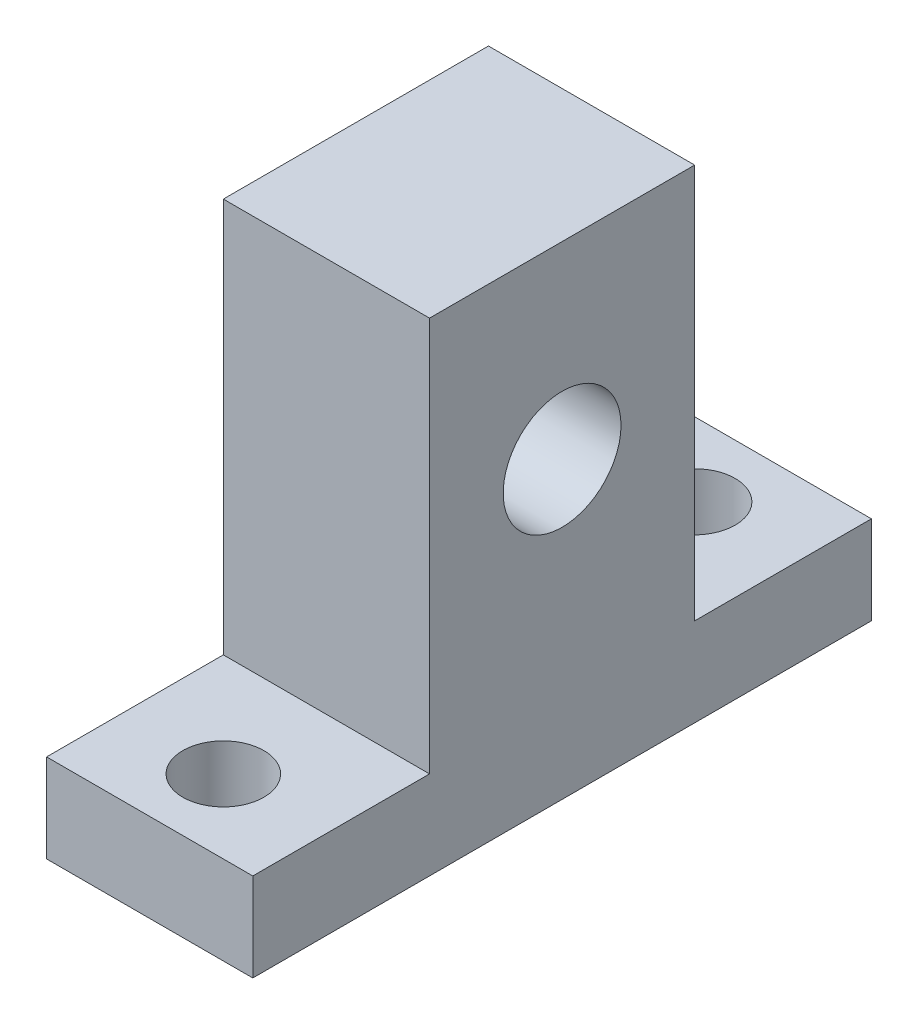
ISO-10303-21;
HEADER;
FILE_DESCRIPTION(('STEP AP214'),'2;1');
FILE_NAME('part.step','',(''),(''),'','','');
FILE_SCHEMA(('AUTOMOTIVE_DESIGN { 1 0 10303 214 1 1 1 1 }'));
ENDSEC;
DATA;
#1=APPLICATION_CONTEXT('core data for automotive mechanical design processes');
#2=APPLICATION_PROTOCOL_DEFINITION('international standard','automotive_design',2000,#1);
#3=PRODUCT_CONTEXT('',#1,'mechanical');
#4=PRODUCT('Part','Part','',(#3));
#5=PRODUCT_RELATED_PRODUCT_CATEGORY('part','',(#4));
#6=PRODUCT_DEFINITION_FORMATION('','',#4);
#7=PRODUCT_DEFINITION_CONTEXT('part definition',#1,'design');
#8=PRODUCT_DEFINITION('design','',#6,#7);
#9=PRODUCT_DEFINITION_SHAPE('','',#8);
#10=(LENGTH_UNIT() NAMED_UNIT(*) SI_UNIT(.MILLI.,.METRE.));
#11=(NAMED_UNIT(*) PLANE_ANGLE_UNIT() SI_UNIT($,.RADIAN.));
#12=(NAMED_UNIT(*) SI_UNIT($,.STERADIAN.) SOLID_ANGLE_UNIT());
#13=UNCERTAINTY_MEASURE_WITH_UNIT(LENGTH_MEASURE(1.E-05),#10,'distance_accuracy_value','');
#14=(GEOMETRIC_REPRESENTATION_CONTEXT(3) GLOBAL_UNCERTAINTY_ASSIGNED_CONTEXT((#13)) GLOBAL_UNIT_ASSIGNED_CONTEXT((#10,
#11,#12)) REPRESENTATION_CONTEXT('',''));
#15=CARTESIAN_POINT('',(0.,0.,0.));
#16=DIRECTION('',(0.,0.,1.));
#17=DIRECTION('',(1.,0.,0.));
#18=AXIS2_PLACEMENT_3D('',#15,#16,#17);
#19=CARTESIAN_POINT('',(14.,0.,0.));
#20=DIRECTION('',(-1.,0.,0.));
#21=DIRECTION('',(0.,0.,1.));
#22=AXIS2_PLACEMENT_3D('',#19,#20,#21);
#23=PLANE('',#22);
#24=DIRECTION('',(0.,-1.,0.));
#25=VECTOR('',#24,1.);
#26=CARTESIAN_POINT('',(14.,0.,21.));
#27=LINE('',#26,#25);
#28=CARTESIAN_POINT('',(14.,6.,21.));
#29=VERTEX_POINT('',#28);
#30=CARTESIAN_POINT('',(14.,0.,21.));
#31=VERTEX_POINT('',#30);
#32=EDGE_CURVE('E146',#29,#31,#27,.T.);
#33=ORIENTED_EDGE('',*,*,#32,.T.);
#34=DIRECTION('',(0.,0.,-1.));
#35=VECTOR('',#34,1.);
#36=CARTESIAN_POINT('',(14.,2.22044604925031E-13,-21.));
#37=LINE('',#36,#35);
#38=CARTESIAN_POINT('',(14.,2.22044604925031E-13,-21.));
#39=VERTEX_POINT('',#38);
#40=EDGE_CURVE('E94',#31,#39,#37,.T.);
#41=ORIENTED_EDGE('',*,*,#40,.T.);
#42=DIRECTION('',(0.,1.,0.));
#43=VECTOR('',#42,1.);
#44=CARTESIAN_POINT('',(14.,2.22044604925031E-13,-21.));
#45=LINE('',#44,#43);
#46=CARTESIAN_POINT('',(14.,6.00000000000022,-21.));
#47=VERTEX_POINT('',#46);
#48=EDGE_CURVE('E161',#39,#47,#45,.T.);
#49=ORIENTED_EDGE('',*,*,#48,.T.);
#50=DIRECTION('',(0.,0.,1.));
#51=VECTOR('',#50,1.);
#52=CARTESIAN_POINT('',(14.,6.00000000000022,-21.));
#53=LINE('',#52,#51);
#54=CARTESIAN_POINT('',(14.,6.,-8.99999999999996));
#55=VERTEX_POINT('',#54);
#56=EDGE_CURVE('E174',#47,#55,#53,.T.);
#57=ORIENTED_EDGE('',*,*,#56,.T.);
#58=DIRECTION('',(0.,1.,0.));
#59=VECTOR('',#58,1.);
#60=CARTESIAN_POINT('',(14.,6.,-8.99999999999996));
#61=LINE('',#60,#59);
#62=CARTESIAN_POINT('',(14.,32.8,-8.99999999999977));
#63=VERTEX_POINT('',#62);
#64=EDGE_CURVE('E113',#55,#63,#61,.T.);
#65=ORIENTED_EDGE('',*,*,#64,.T.);
#66=DIRECTION('',(0.,0.,1.));
#67=VECTOR('',#66,1.);
#68=CARTESIAN_POINT('',(14.,32.8,9.));
#69=LINE('',#68,#67);
#70=CARTESIAN_POINT('',(14.,32.8,9.));
#71=VERTEX_POINT('',#70);
#72=EDGE_CURVE('E107',#63,#71,#69,.T.);
#73=ORIENTED_EDGE('',*,*,#72,.T.);
#74=DIRECTION('',(0.,-1.,0.));
#75=VECTOR('',#74,1.);
#76=CARTESIAN_POINT('',(14.,6.,9.));
#77=LINE('',#76,#75);
#78=CARTESIAN_POINT('',(14.,6.,9.));
#79=VERTEX_POINT('',#78);
#80=EDGE_CURVE('E111',#71,#79,#77,.T.);
#81=ORIENTED_EDGE('',*,*,#80,.T.);
#82=DIRECTION('',(0.,0.,1.));
#83=VECTOR('',#82,1.);
#84=CARTESIAN_POINT('',(14.,6.,21.));
#85=LINE('',#84,#83);
#86=EDGE_CURVE('E51',#79,#29,#85,.T.);
#87=ORIENTED_EDGE('',*,*,#86,.T.);
#88=EDGE_LOOP('',(#33,#41,#49,#57,#65,#73,#81,#87));
#89=FACE_BOUND('',#88,.T.);
#90=CARTESIAN_POINT('',(14.,20.,0.));
#91=DIRECTION('',(1.,0.,0.));
#92=DIRECTION('',(0.,0.,-1.));
#93=AXIS2_PLACEMENT_3D('',#90,#91,#92);
#94=CIRCLE('',#93,4.);
#95=CARTESIAN_POINT('',(14.,20.,-4.));
#96=VERTEX_POINT('',#95);
#97=EDGE_CURVE('E135',#96,#96,#94,.T.);
#98=ORIENTED_EDGE('',*,*,#97,.F.);
#99=EDGE_LOOP('',(#98));
#100=FACE_BOUND('',#99,.T.);
#101=ADVANCED_FACE('F34',(#89,#100),#23,.F.);
#102=CARTESIAN_POINT('',(0.,0.,0.));
#103=DIRECTION('',(-1.,0.,0.));
#104=DIRECTION('',(0.,0.,1.));
#105=AXIS2_PLACEMENT_3D('',#102,#103,#104);
#106=PLANE('',#105);
#107=DIRECTION('',(0.,-1.,0.));
#108=VECTOR('',#107,1.);
#109=CARTESIAN_POINT('',(0.,0.,21.));
#110=LINE('',#109,#108);
#111=CARTESIAN_POINT('',(0.,6.,21.));
#112=VERTEX_POINT('',#111);
#113=CARTESIAN_POINT('',(0.,0.,21.));
#114=VERTEX_POINT('',#113);
#115=EDGE_CURVE('E131',#112,#114,#110,.T.);
#116=ORIENTED_EDGE('',*,*,#115,.F.);
#117=DIRECTION('',(0.,0.,1.));
#118=VECTOR('',#117,1.);
#119=CARTESIAN_POINT('',(0.,6.,21.));
#120=LINE('',#119,#118);
#121=CARTESIAN_POINT('',(0.,6.,9.));
#122=VERTEX_POINT('',#121);
#123=EDGE_CURVE('E86',#122,#112,#120,.T.);
#124=ORIENTED_EDGE('',*,*,#123,.F.);
#125=DIRECTION('',(0.,-1.,0.));
#126=VECTOR('',#125,1.);
#127=CARTESIAN_POINT('',(0.,6.,9.));
#128=LINE('',#127,#126);
#129=CARTESIAN_POINT('',(0.,32.8,9.));
#130=VERTEX_POINT('',#129);
#131=EDGE_CURVE('E80',#130,#122,#128,.T.);
#132=ORIENTED_EDGE('',*,*,#131,.F.);
#133=DIRECTION('',(0.,0.,1.));
#134=VECTOR('',#133,1.);
#135=CARTESIAN_POINT('',(0.,32.8,9.));
#136=LINE('',#135,#134);
#137=CARTESIAN_POINT('',(0.,32.8,-8.99999999999977));
#138=VERTEX_POINT('',#137);
#139=EDGE_CURVE('E121',#138,#130,#136,.T.);
#140=ORIENTED_EDGE('',*,*,#139,.F.);
#141=DIRECTION('',(0.,1.,0.));
#142=VECTOR('',#141,1.);
#143=CARTESIAN_POINT('',(0.,6.,-8.99999999999996));
#144=LINE('',#143,#142);
#145=CARTESIAN_POINT('',(0.,6.,-8.99999999999996));
#146=VERTEX_POINT('',#145);
#147=EDGE_CURVE('E141',#146,#138,#144,.T.);
#148=ORIENTED_EDGE('',*,*,#147,.F.);
#149=DIRECTION('',(0.,0.,1.));
#150=VECTOR('',#149,1.);
#151=CARTESIAN_POINT('',(0.,6.00000000000022,-21.));
#152=LINE('',#151,#150);
#153=CARTESIAN_POINT('',(0.,6.00000000000022,-21.));
#154=VERTEX_POINT('',#153);
#155=EDGE_CURVE('E139',#154,#146,#152,.T.);
#156=ORIENTED_EDGE('',*,*,#155,.F.);
#157=DIRECTION('',(0.,1.,0.));
#158=VECTOR('',#157,1.);
#159=CARTESIAN_POINT('',(0.,2.22044604925031E-13,-21.));
#160=LINE('',#159,#158);
#161=CARTESIAN_POINT('',(0.,2.22044604925031E-13,-21.));
#162=VERTEX_POINT('',#161);
#163=EDGE_CURVE('E137',#162,#154,#160,.T.);
#164=ORIENTED_EDGE('',*,*,#163,.F.);
#165=DIRECTION('',(0.,0.,-1.));
#166=VECTOR('',#165,1.);
#167=CARTESIAN_POINT('',(0.,2.22044604925031E-13,-21.));
#168=LINE('',#167,#166);
#169=EDGE_CURVE('E134',#114,#162,#168,.T.);
#170=ORIENTED_EDGE('',*,*,#169,.F.);
#171=EDGE_LOOP('',(#116,#124,#132,#140,#148,#156,#164,#170));
#172=FACE_BOUND('',#171,.T.);
#173=CARTESIAN_POINT('',(0.,20.,0.));
#174=DIRECTION('',(1.,0.,0.));
#175=DIRECTION('',(0.,0.,-1.));
#176=AXIS2_PLACEMENT_3D('',#173,#174,#175);
#177=CIRCLE('',#176,4.);
#178=CARTESIAN_POINT('',(0.,20.,-4.));
#179=VERTEX_POINT('',#178);
#180=EDGE_CURVE('E180',#179,#179,#177,.T.);
#181=ORIENTED_EDGE('',*,*,#180,.T.);
#182=EDGE_LOOP('',(#181));
#183=FACE_BOUND('',#182,.T.);
#184=ADVANCED_FACE('F165',(#172,#183),#106,.T.);
#185=CARTESIAN_POINT('',(14.,0.,21.));
#186=DIRECTION('',(0.,0.,-1.));
#187=DIRECTION('',(-1.,0.,0.));
#188=AXIS2_PLACEMENT_3D('',#185,#186,#187);
#189=PLANE('',#188);
#190=ORIENTED_EDGE('',*,*,#115,.T.);
#191=DIRECTION('',(-1.,0.,0.));
#192=VECTOR('',#191,1.);
#193=CARTESIAN_POINT('',(14.,0.,21.));
#194=LINE('',#193,#192);
#195=EDGE_CURVE('E11',#31,#114,#194,.T.);
#196=ORIENTED_EDGE('',*,*,#195,.F.);
#197=ORIENTED_EDGE('',*,*,#32,.F.);
#198=DIRECTION('',(-1.,0.,0.));
#199=VECTOR('',#198,1.);
#200=CARTESIAN_POINT('',(14.,6.,21.));
#201=LINE('',#200,#199);
#202=EDGE_CURVE('E127',#29,#112,#201,.T.);
#203=ORIENTED_EDGE('',*,*,#202,.T.);
#204=EDGE_LOOP('',(#190,#196,#197,#203));
#205=FACE_BOUND('',#204,.T.);
#206=ADVANCED_FACE('F36',(#205),#189,.F.);
#207=CARTESIAN_POINT('',(14.,2.22044604925031E-13,-21.));
#208=DIRECTION('',(0.,1.,0.));
#209=DIRECTION('',(0.,0.,1.));
#210=AXIS2_PLACEMENT_3D('',#207,#208,#209);
#211=PLANE('',#210);
#212=CARTESIAN_POINT('',(7.,1.96023752785379E-13,-16.));
#213=DIRECTION('',(0.,1.,0.));
#214=DIRECTION('',(0.,0.,1.));
#215=AXIS2_PLACEMENT_3D('',#212,#213,#214);
#216=CIRCLE('',#215,2.75);
#217=CARTESIAN_POINT('',(7.,1.81485117939097E-13,-13.25));
#218=VERTEX_POINT('',#217);
#219=EDGE_CURVE('E183',#218,#218,#216,.T.);
#220=ORIENTED_EDGE('',*,*,#219,.T.);
#221=EDGE_LOOP('',(#220));
#222=FACE_BOUND('',#221,.T.);
#223=CARTESIAN_POINT('',(7.,0.,16.));
#224=DIRECTION('',(0.,1.,0.));
#225=DIRECTION('',(0.,0.,1.));
#226=AXIS2_PLACEMENT_3D('',#223,#224,#225);
#227=CIRCLE('',#226,2.75);
#228=CARTESIAN_POINT('',(7.,0.,18.75));
#229=VERTEX_POINT('',#228);
#230=EDGE_CURVE('E188',#229,#229,#227,.T.);
#231=ORIENTED_EDGE('',*,*,#230,.T.);
#232=EDGE_LOOP('',(#231));
#233=FACE_BOUND('',#232,.T.);
#234=ORIENTED_EDGE('',*,*,#169,.T.);
#235=DIRECTION('',(-1.,0.,0.));
#236=VECTOR('',#235,1.);
#237=CARTESIAN_POINT('',(14.,2.22044604925031E-13,-21.));
#238=LINE('',#237,#236);
#239=EDGE_CURVE('E43',#39,#162,#238,.T.);
#240=ORIENTED_EDGE('',*,*,#239,.F.);
#241=ORIENTED_EDGE('',*,*,#40,.F.);
#242=ORIENTED_EDGE('',*,*,#195,.T.);
#243=EDGE_LOOP('',(#234,#240,#241,#242));
#244=FACE_BOUND('',#243,.T.);
#245=ADVANCED_FACE('F208',(#222,#233,#244),#211,.F.);
#246=CARTESIAN_POINT('',(14.,2.22044604925031E-13,-21.));
#247=DIRECTION('',(0.,0.,1.));
#248=DIRECTION('',(0.,-1.,0.));
#249=AXIS2_PLACEMENT_3D('',#246,#247,#248);
#250=PLANE('',#249);
#251=ORIENTED_EDGE('',*,*,#163,.T.);
#252=DIRECTION('',(-1.,0.,0.));
#253=VECTOR('',#252,1.);
#254=CARTESIAN_POINT('',(14.,6.00000000000022,-21.));
#255=LINE('',#254,#253);
#256=EDGE_CURVE('E153',#47,#154,#255,.T.);
#257=ORIENTED_EDGE('',*,*,#256,.F.);
#258=ORIENTED_EDGE('',*,*,#48,.F.);
#259=ORIENTED_EDGE('',*,*,#239,.T.);
#260=EDGE_LOOP('',(#251,#257,#258,#259));
#261=FACE_BOUND('',#260,.T.);
#262=ADVANCED_FACE('F159',(#261),#250,.F.);
#263=CARTESIAN_POINT('',(14.,6.00000000000022,-21.));
#264=DIRECTION('',(0.,-1.,0.));
#265=DIRECTION('',(0.,0.,-1.));
#266=AXIS2_PLACEMENT_3D('',#263,#264,#265);
#267=PLANE('',#266);
#268=CARTESIAN_POINT('',(7.,6.00000000000013,-15.9999999999999));
#269=DIRECTION('',(0.,1.,0.));
#270=DIRECTION('',(0.,0.,1.));
#271=AXIS2_PLACEMENT_3D('',#268,#269,#270);
#272=CIRCLE('',#271,2.75);
#273=CARTESIAN_POINT('',(7.,6.00000000000008,-13.2499999999999));
#274=VERTEX_POINT('',#273);
#275=EDGE_CURVE('E191',#274,#274,#272,.T.);
#276=ORIENTED_EDGE('',*,*,#275,.F.);
#277=EDGE_LOOP('',(#276));
#278=FACE_BOUND('',#277,.T.);
#279=ORIENTED_EDGE('',*,*,#155,.T.);
#280=DIRECTION('',(-1.,0.,0.));
#281=VECTOR('',#280,1.);
#282=CARTESIAN_POINT('',(14.,6.,-8.99999999999996));
#283=LINE('',#282,#281);
#284=EDGE_CURVE('E150',#55,#146,#283,.T.);
#285=ORIENTED_EDGE('',*,*,#284,.F.);
#286=ORIENTED_EDGE('',*,*,#56,.F.);
#287=ORIENTED_EDGE('',*,*,#256,.T.);
#288=EDGE_LOOP('',(#279,#285,#286,#287));
#289=FACE_BOUND('',#288,.T.);
#290=ADVANCED_FACE('F170',(#278,#289),#267,.F.);
#291=CARTESIAN_POINT('',(14.,6.,-8.99999999999996));
#292=DIRECTION('',(0.,0.,1.));
#293=DIRECTION('',(0.,-1.,0.));
#294=AXIS2_PLACEMENT_3D('',#291,#292,#293);
#295=PLANE('',#294);
#296=ORIENTED_EDGE('',*,*,#147,.T.);
#297=DIRECTION('',(-1.,0.,0.));
#298=VECTOR('',#297,1.);
#299=CARTESIAN_POINT('',(14.,32.8,-8.99999999999977));
#300=LINE('',#299,#298);
#301=EDGE_CURVE('E122',#63,#138,#300,.T.);
#302=ORIENTED_EDGE('',*,*,#301,.F.);
#303=ORIENTED_EDGE('',*,*,#64,.F.);
#304=ORIENTED_EDGE('',*,*,#284,.T.);
#305=EDGE_LOOP('',(#296,#302,#303,#304));
#306=FACE_BOUND('',#305,.T.);
#307=ADVANCED_FACE('F173',(#306),#295,.F.);
#308=CARTESIAN_POINT('',(14.,32.8,9.));
#309=DIRECTION('',(0.,-1.,0.));
#310=DIRECTION('',(0.,0.,-1.));
#311=AXIS2_PLACEMENT_3D('',#308,#309,#310);
#312=PLANE('',#311);
#313=ORIENTED_EDGE('',*,*,#139,.T.);
#314=DIRECTION('',(-1.,0.,0.));
#315=VECTOR('',#314,1.);
#316=CARTESIAN_POINT('',(14.,32.8,9.));
#317=LINE('',#316,#315);
#318=EDGE_CURVE('E118',#71,#130,#317,.T.);
#319=ORIENTED_EDGE('',*,*,#318,.F.);
#320=ORIENTED_EDGE('',*,*,#72,.F.);
#321=ORIENTED_EDGE('',*,*,#301,.T.);
#322=EDGE_LOOP('',(#313,#319,#320,#321));
#323=FACE_BOUND('',#322,.T.);
#324=ADVANCED_FACE('F119',(#323),#312,.F.);
#325=CARTESIAN_POINT('',(14.,6.,9.));
#326=DIRECTION('',(0.,0.,-1.));
#327=DIRECTION('',(-1.,0.,0.));
#328=AXIS2_PLACEMENT_3D('',#325,#326,#327);
#329=PLANE('',#328);
#330=ORIENTED_EDGE('',*,*,#131,.T.);
#331=DIRECTION('',(-1.,0.,0.));
#332=VECTOR('',#331,1.);
#333=CARTESIAN_POINT('',(14.,6.,9.));
#334=LINE('',#333,#332);
#335=EDGE_CURVE('E123',#79,#122,#334,.T.);
#336=ORIENTED_EDGE('',*,*,#335,.F.);
#337=ORIENTED_EDGE('',*,*,#80,.F.);
#338=ORIENTED_EDGE('',*,*,#318,.T.);
#339=EDGE_LOOP('',(#330,#336,#337,#338));
#340=FACE_BOUND('',#339,.T.);
#341=ADVANCED_FACE('F125',(#340),#329,.F.);
#342=CARTESIAN_POINT('',(14.,6.,21.));
#343=DIRECTION('',(0.,-1.,0.));
#344=DIRECTION('',(0.,0.,-1.));
#345=AXIS2_PLACEMENT_3D('',#342,#343,#344);
#346=PLANE('',#345);
#347=CARTESIAN_POINT('',(7.,5.99999999999954,16.0000000000001));
#348=DIRECTION('',(0.,1.,0.));
#349=DIRECTION('',(0.,0.,1.));
#350=AXIS2_PLACEMENT_3D('',#347,#348,#349);
#351=CIRCLE('',#350,2.75);
#352=CARTESIAN_POINT('',(7.,5.99999999999949,18.7500000000001));
#353=VERTEX_POINT('',#352);
#354=EDGE_CURVE('E192',#353,#353,#351,.T.);
#355=ORIENTED_EDGE('',*,*,#354,.F.);
#356=EDGE_LOOP('',(#355));
#357=FACE_BOUND('',#356,.T.);
#358=ORIENTED_EDGE('',*,*,#123,.T.);
#359=ORIENTED_EDGE('',*,*,#202,.F.);
#360=ORIENTED_EDGE('',*,*,#86,.F.);
#361=ORIENTED_EDGE('',*,*,#335,.T.);
#362=EDGE_LOOP('',(#358,#359,#360,#361));
#363=FACE_BOUND('',#362,.T.);
#364=ADVANCED_FACE('F220',(#357,#363),#346,.F.);
#365=CARTESIAN_POINT('',(14.,20.,0.));
#366=DIRECTION('',(-1.,0.,0.));
#367=DIRECTION('',(0.,0.,1.));
#368=AXIS2_PLACEMENT_3D('',#365,#366,#367);
#369=CYLINDRICAL_SURFACE('',#368,4.);
#370=ORIENTED_EDGE('',*,*,#97,.T.);
#371=EDGE_LOOP('',(#370));
#372=FACE_BOUND('',#371,.T.);
#373=ORIENTED_EDGE('',*,*,#180,.F.);
#374=EDGE_LOOP('',(#373));
#375=FACE_BOUND('',#374,.T.);
#376=ADVANCED_FACE('F217',(#372,#375),#369,.F.);
#377=CARTESIAN_POINT('',(7.,-8.00000000000046,15.9999999999999));
#378=DIRECTION('',(0.,1.,0.));
#379=DIRECTION('',(0.,0.,1.));
#380=AXIS2_PLACEMENT_3D('',#377,#378,#379);
#381=CYLINDRICAL_SURFACE('',#380,2.75);
#382=ORIENTED_EDGE('',*,*,#354,.T.);
#383=EDGE_LOOP('',(#382));
#384=FACE_BOUND('',#383,.T.);
#385=ORIENTED_EDGE('',*,*,#230,.F.);
#386=EDGE_LOOP('',(#385));
#387=FACE_BOUND('',#386,.T.);
#388=ADVANCED_FACE('F246',(#384,#387),#381,.F.);
#389=CARTESIAN_POINT('',(7.,-7.99999999999987,-16.0000000000001));
#390=DIRECTION('',(0.,1.,0.));
#391=DIRECTION('',(0.,0.,1.));
#392=AXIS2_PLACEMENT_3D('',#389,#390,#391);
#393=CYLINDRICAL_SURFACE('',#392,2.75);
#394=ORIENTED_EDGE('',*,*,#275,.T.);
#395=EDGE_LOOP('',(#394));
#396=FACE_BOUND('',#395,.T.);
#397=ORIENTED_EDGE('',*,*,#219,.F.);
#398=EDGE_LOOP('',(#397));
#399=FACE_BOUND('',#398,.T.);
#400=ADVANCED_FACE('F198',(#396,#399),#393,.F.);
#401=CLOSED_SHELL('',(#101,#184,#206,#245,#262,#290,#307,#324,#341,#364,#376,#388,#400));
#402=MANIFOLD_SOLID_BREP('B2',#401);
#403=ADVANCED_BREP_SHAPE_REPRESENTATION('',(#18,#402),#14);
#404=SHAPE_DEFINITION_REPRESENTATION(#9,#403);
ENDSEC;
END-ISO-10303-21;
